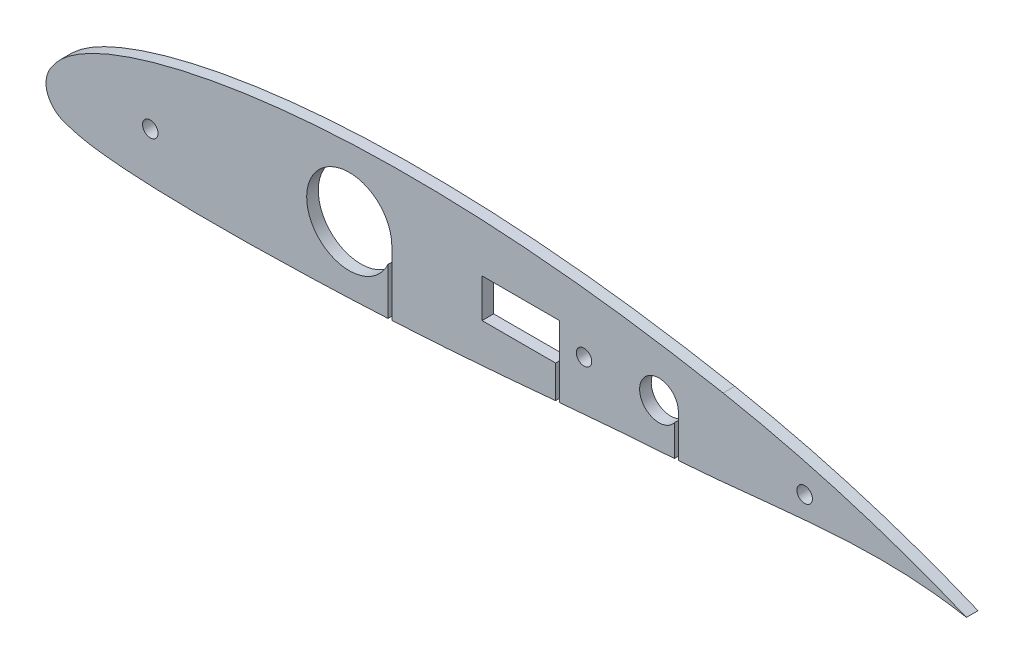
ISO-10303-21;
HEADER;
FILE_DESCRIPTION(('STEP AP214'),'2;1');
FILE_NAME('part.step','',(''),(''),'','','');
FILE_SCHEMA(('AUTOMOTIVE_DESIGN { 1 0 10303 214 1 1 1 1 }'));
ENDSEC;
DATA;
#1=APPLICATION_CONTEXT('core data for automotive mechanical design processes');
#2=APPLICATION_PROTOCOL_DEFINITION('international standard','automotive_design',2000,#1);
#3=PRODUCT_CONTEXT('',#1,'mechanical');
#4=PRODUCT('Part','Part','',(#3));
#5=PRODUCT_RELATED_PRODUCT_CATEGORY('part','',(#4));
#6=PRODUCT_DEFINITION_FORMATION('','',#4);
#7=PRODUCT_DEFINITION_CONTEXT('part definition',#1,'design');
#8=PRODUCT_DEFINITION('design','',#6,#7);
#9=PRODUCT_DEFINITION_SHAPE('','',#8);
#10=(LENGTH_UNIT() NAMED_UNIT(*) SI_UNIT(.MILLI.,.METRE.));
#11=(NAMED_UNIT(*) PLANE_ANGLE_UNIT() SI_UNIT($,.RADIAN.));
#12=(NAMED_UNIT(*) SI_UNIT($,.STERADIAN.) SOLID_ANGLE_UNIT());
#13=UNCERTAINTY_MEASURE_WITH_UNIT(LENGTH_MEASURE(1.E-05),#10,'distance_accuracy_value','');
#14=(GEOMETRIC_REPRESENTATION_CONTEXT(3) GLOBAL_UNCERTAINTY_ASSIGNED_CONTEXT((#13)) GLOBAL_UNIT_ASSIGNED_CONTEXT((#10,
#11,#12)) REPRESENTATION_CONTEXT('',''));
#15=CARTESIAN_POINT('',(0.,0.,0.));
#16=DIRECTION('',(0.,0.,1.));
#17=DIRECTION('',(1.,0.,0.));
#18=AXIS2_PLACEMENT_3D('',#15,#16,#17);
#19=CARTESIAN_POINT('',(23.2750330170003,31.2169723002843,3.));
#20=CARTESIAN_POINT('',(57.322884726353,25.0727517741864,3.));
#21=CARTESIAN_POINT('',(89.0015893645382,11.9045994903133,3.));
#22=B_SPLINE_CURVE_WITH_KNOTS('',2,(#19,#20,#21),.UNSPECIFIED.,.F.,.F.,(3,3),(0.,1.),.UNSPECIFIED.);
#23=DIRECTION('',(0.,0.,-1.));
#24=VECTOR('',#23,1.);
#25=SURFACE_OF_LINEAR_EXTRUSION('',#22,#24);
#26=CARTESIAN_POINT('',(23.2750330170003,31.2169723002843,0.));
#27=CARTESIAN_POINT('',(57.322884726353,25.0727517741864,0.));
#28=CARTESIAN_POINT('',(89.0015893645382,11.9045994903133,0.));
#29=B_SPLINE_CURVE_WITH_KNOTS('',2,(#26,#27,#28),.UNSPECIFIED.,.F.,.F.,(3,3),(0.,1.),.UNSPECIFIED.);
#30=CARTESIAN_POINT('',(26.1699744644814,30.6810485007294,0.));
#31=VERTEX_POINT('',#30);
#32=CARTESIAN_POINT('',(89.0015893645382,11.9045994903133,0.));
#33=VERTEX_POINT('',#32);
#34=EDGE_CURVE('E319',#31,#33,#29,.T.);
#35=ORIENTED_EDGE('',*,*,#34,.F.);
#36=DIRECTION('',(0.,0.,-1.));
#37=VECTOR('',#36,1.);
#38=CARTESIAN_POINT('',(26.1699744644814,30.6810485007294,3.));
#39=LINE('',#38,#37);
#40=CARTESIAN_POINT('',(26.1699744644814,30.6810485007294,3.));
#41=VERTEX_POINT('',#40);
#42=EDGE_CURVE('E11',#41,#31,#39,.T.);
#43=ORIENTED_EDGE('',*,*,#42,.F.);
#44=CARTESIAN_POINT('',(89.0015893645382,11.9045994903133,3.));
#45=VERTEX_POINT('',#44);
#46=EDGE_CURVE('E278',#41,#45,#22,.T.);
#47=ORIENTED_EDGE('',*,*,#46,.T.);
#48=DIRECTION('',(0.,0.,-1.));
#49=VECTOR('',#48,1.);
#50=CARTESIAN_POINT('',(89.0015893645382,11.9045994903133,3.));
#51=LINE('',#50,#49);
#52=EDGE_CURVE('E112',#45,#33,#51,.T.);
#53=ORIENTED_EDGE('',*,*,#52,.T.);
#54=EDGE_LOOP('',(#35,#43,#47,#53));
#55=FACE_BOUND('',#54,.T.);
#56=ADVANCED_FACE('F36',(#55),#25,.T.);
#57=CARTESIAN_POINT('',(26.1704792292799,30.6809526939739,3.));
#58=CARTESIAN_POINT('',(25.0717405489506,30.8872838946798,3.));
#59=CARTESIAN_POINT('',(21.652580786169,31.5190877367356,3.));
#60=CARTESIAN_POINT('',(15.9021602601808,32.5263185505152,3.));
#61=CARTESIAN_POINT('',(6.5790106509309,34.0330156957258,3.));
#62=CARTESIAN_POINT('',(-5.13305586683516,35.6661162166546,3.));
#63=CARTESIAN_POINT('',(-19.2486482424457,37.1612529151443,3.));
#64=CARTESIAN_POINT('',(-33.4033089772614,38.2059301904757,3.));
#65=CARTESIAN_POINT('',(-47.6088661564467,38.7588946065387,3.));
#66=CARTESIAN_POINT('',(-61.8320058552231,38.778890696768,3.));
#67=CARTESIAN_POINT('',(-73.7054715748674,38.3053812763915,3.));
#68=CARTESIAN_POINT('',(-83.1964144769099,37.5817759337847,3.));
#69=CARTESIAN_POINT('',(-90.3084209767789,36.856137814495,3.));
#70=CARTESIAN_POINT('',(-97.4054819679649,35.9335334631067,3.));
#71=CARTESIAN_POINT('',(-104.490167790152,34.7992842236308,3.));
#72=CARTESIAN_POINT('',(-111.557384973087,33.4138010473869,3.));
#73=CARTESIAN_POINT('',(-117.418017458013,32.0271748518416,3.));
#74=CARTESIAN_POINT('',(-122.096415740499,30.7376651009451,3.));
#75=CARTESIAN_POINT('',(-125.595780153855,29.6654094572892,3.));
#76=CARTESIAN_POINT('',(-129.078314362397,28.4750657683779,3.));
#77=CARTESIAN_POINT('',(-132.551428441074,27.1359892047304,3.));
#78=CARTESIAN_POINT('',(-135.438628174777,25.8622456958523,3.));
#79=CARTESIAN_POINT('',(-137.734204272677,24.7127565401623,3.));
#80=CARTESIAN_POINT('',(-139.456975034569,23.7687359755543,3.));
#81=CARTESIAN_POINT('',(-141.183426846913,22.7095626994774,3.));
#82=CARTESIAN_POINT('',(-142.615229883941,21.7137600315637,3.));
#83=CARTESIAN_POINT('',(-143.778010070149,20.7915841528106,3.));
#84=CARTESIAN_POINT('',(-144.642296680003,20.0313522172483,3.));
#85=CARTESIAN_POINT('',(-145.488501268653,19.1917681703995,3.));
#86=CARTESIAN_POINT('',(-146.295459405737,18.2764703412122,3.));
#87=CARTESIAN_POINT('',(-146.924853395195,17.4460153744084,3.));
#88=CARTESIAN_POINT('',(-147.402133682582,16.7479200861963,3.));
#89=CARTESIAN_POINT('',(-147.861509391881,15.9872821842199,3.));
#90=CARTESIAN_POINT('',(-148.257481401975,15.1336275035934,3.));
#91=CARTESIAN_POINT('',(-148.525334698643,14.278259778442,3.));
#92=CARTESIAN_POINT('',(-148.652359182012,13.6789166841946,3.));
#93=CARTESIAN_POINT('',(-148.715065866693,13.1462221173314,3.));
#94=CARTESIAN_POINT('',(-148.743623833541,12.7702519323825,3.));
#95=CARTESIAN_POINT('',(-148.736306405036,12.1170794840155,3.));
#96=CARTESIAN_POINT('',(-148.641099683932,11.3518403393092,3.));
#97=CARTESIAN_POINT('',(-148.411222248835,10.482363072398,3.));
#98=CARTESIAN_POINT('',(-147.899630282323,9.33270938205806,3.));
#99=CARTESIAN_POINT('',(-147.131184271557,8.25338851377815,3.));
#100=CARTESIAN_POINT('',(-146.090595980271,7.28025085323282,3.));
#101=CARTESIAN_POINT('',(-145.034194906505,6.60431910234987,3.));
#102=CARTESIAN_POINT('',(-144.099388819754,6.17635609162901,3.));
#103=CARTESIAN_POINT('',(-143.327943825418,5.90725228821735,3.));
#104=CARTESIAN_POINT('',(-142.744414150697,5.73697335113027,3.));
#105=CARTESIAN_POINT('',(-142.324681368872,5.61809019188374,3.));
#106=CARTESIAN_POINT('',(-141.712355660487,5.44663637945664,3.));
#107=CARTESIAN_POINT('',(-140.948050307236,5.24093024503892,3.));
#108=CARTESIAN_POINT('',(-139.679457393446,4.92319090354122,3.));
#109=CARTESIAN_POINT('',(-138.006428536994,4.57592919565911,3.));
#110=CARTESIAN_POINT('',(-136.07939986065,4.27856887698454,3.));
#111=CARTESIAN_POINT('',(-134.23248766641,4.04820020820924,3.));
#112=CARTESIAN_POINT('',(-132.422823201688,3.84902121924409,3.));
#113=CARTESIAN_POINT('',(-130.005739205579,3.61690026067817,3.));
#114=CARTESIAN_POINT('',(-126.996429967849,3.3866910853606,3.));
#115=CARTESIAN_POINT('',(-123.404146631862,3.18712871164537,3.));
#116=CARTESIAN_POINT('',(-119.838868339944,3.04101931502466,3.));
#117=CARTESIAN_POINT('',(-116.279828867201,2.93544987488144,3.));
#118=CARTESIAN_POINT('',(-111.547802169114,2.84039807880746,3.));
#119=CARTESIAN_POINT('',(-105.642152982149,2.793208736225,3.));
#120=CARTESIAN_POINT('',(-98.5711569175861,2.82663766533563,3.));
#121=CARTESIAN_POINT('',(-91.5113595976478,2.93151483705376,3.));
#122=CARTESIAN_POINT('',(-84.4586430065639,3.09693138211099,3.));
#123=CARTESIAN_POINT('',(-75.05737687348,3.39102216663977,3.));
#124=CARTESIAN_POINT('',(-67.0431312582729,3.73563635821174,3.));
#125=CARTESIAN_POINT('',(-61.3781790643248,4.02392346362659,3.));
#126=CARTESIAN_POINT('',(-60.4067661398195,4.07473548579845,3.));
#127=B_SPLINE_CURVE_WITH_KNOTS('',3,(#57,#58,#59,#60,#61,#62,#63,#64,#65,#66,#67,#68,#69,#70,
#71,#72,#73,#74,#75,#76,#77,#78,#79,#80,#81,#82,#83,#84,#85,#86,#87,#88,#89,#90,#91,#92,#93,#94,
#95,#96,#97,#98,#99,#100,#101,#102,#103,#104,#105,#106,#107,#108,#109,#110,#111,#112,#113,#114,
#115,#116,#117,#118,#119,#120,#121,#122,#123,#124,#125,#126),.UNSPECIFIED.,.F.,.F.,(4,1,1,1,1,1,
1,1,1,1,1,1,1,1,1,1,1,1,1,1,1,1,1,1,1,1,1,1,1,1,1,1,1,1,1,1,1,1,1,1,1,1,1,1,1,1,1,1,1,1,1,1,1,1,
1,1,1,1,1,1,1,1,1,1,1,1,1,4),(1.11759424258564,1.125,1.140625,1.15625,1.1875,1.21875,1.25,
1.28125,1.3125,1.34375,1.359375,1.375,1.390625,1.40625,1.421875,1.4375,1.4453125,1.453125,
1.4609375,1.46875,1.4765625,1.48046875,1.484375,1.48828125,1.4921875,1.494140625,1.49609375,
1.498046875,1.5,1.501953125,1.5029296875,1.50390625,1.5048828125,1.50537109375,1.505859375,
1.506103515625,1.50634765625,1.506591796875,1.5068359375,1.50732421875,1.5078125,1.5087890625,
1.509765625,1.5107421875,1.51171875,1.5126953125,1.513671875,1.5146484375,1.515625,1.517578125,
1.51953125,1.5234375,1.52734375,1.53125,1.53515625,1.5390625,1.546875,1.5546875,1.5625,
1.5703125,1.578125,1.59375,1.609375,1.625,1.640625,1.65625,1.6875,1.69396803900978),.UNSPECIFIED.);
#128=DIRECTION('',(0.,0.,-1.));
#129=VECTOR('',#128,1.);
#130=SURFACE_OF_LINEAR_EXTRUSION('',#127,#129);
#131=CARTESIAN_POINT('',(26.1704792292799,30.6809526939739,0.));
#132=CARTESIAN_POINT('',(25.0717405489506,30.8872838946798,0.));
#133=CARTESIAN_POINT('',(21.652580786169,31.5190877367356,0.));
#134=CARTESIAN_POINT('',(15.9021602601808,32.5263185505152,0.));
#135=CARTESIAN_POINT('',(6.5790106509309,34.0330156957258,0.));
#136=CARTESIAN_POINT('',(-5.13305586683516,35.6661162166546,0.));
#137=CARTESIAN_POINT('',(-19.2486482424457,37.1612529151443,0.));
#138=CARTESIAN_POINT('',(-33.4033089772614,38.2059301904757,0.));
#139=CARTESIAN_POINT('',(-47.6088661564467,38.7588946065387,0.));
#140=CARTESIAN_POINT('',(-61.8320058552231,38.778890696768,0.));
#141=CARTESIAN_POINT('',(-73.7054715748674,38.3053812763915,0.));
#142=CARTESIAN_POINT('',(-83.1964144769099,37.5817759337847,0.));
#143=CARTESIAN_POINT('',(-90.3084209767789,36.856137814495,0.));
#144=CARTESIAN_POINT('',(-97.4054819679649,35.9335334631067,0.));
#145=CARTESIAN_POINT('',(-104.490167790152,34.7992842236308,0.));
#146=CARTESIAN_POINT('',(-111.557384973087,33.4138010473869,0.));
#147=CARTESIAN_POINT('',(-117.418017458013,32.0271748518416,0.));
#148=CARTESIAN_POINT('',(-122.096415740499,30.7376651009451,0.));
#149=CARTESIAN_POINT('',(-125.595780153855,29.6654094572892,0.));
#150=CARTESIAN_POINT('',(-129.078314362397,28.4750657683779,0.));
#151=CARTESIAN_POINT('',(-132.551428441074,27.1359892047304,0.));
#152=CARTESIAN_POINT('',(-135.438628174777,25.8622456958523,0.));
#153=CARTESIAN_POINT('',(-137.734204272677,24.7127565401623,0.));
#154=CARTESIAN_POINT('',(-139.456975034569,23.7687359755543,0.));
#155=CARTESIAN_POINT('',(-141.183426846913,22.7095626994774,0.));
#156=CARTESIAN_POINT('',(-142.615229883941,21.7137600315637,0.));
#157=CARTESIAN_POINT('',(-143.778010070149,20.7915841528106,0.));
#158=CARTESIAN_POINT('',(-144.642296680003,20.0313522172483,0.));
#159=CARTESIAN_POINT('',(-145.488501268653,19.1917681703995,0.));
#160=CARTESIAN_POINT('',(-146.295459405737,18.2764703412122,0.));
#161=CARTESIAN_POINT('',(-146.924853395195,17.4460153744084,0.));
#162=CARTESIAN_POINT('',(-147.402133682582,16.7479200861963,0.));
#163=CARTESIAN_POINT('',(-147.861509391881,15.9872821842199,0.));
#164=CARTESIAN_POINT('',(-148.257481401975,15.1336275035934,0.));
#165=CARTESIAN_POINT('',(-148.525334698643,14.278259778442,0.));
#166=CARTESIAN_POINT('',(-148.652359182012,13.6789166841946,0.));
#167=CARTESIAN_POINT('',(-148.715065866693,13.1462221173314,0.));
#168=CARTESIAN_POINT('',(-148.743623833541,12.7702519323825,0.));
#169=CARTESIAN_POINT('',(-148.736306405036,12.1170794840155,0.));
#170=CARTESIAN_POINT('',(-148.641099683932,11.3518403393092,0.));
#171=CARTESIAN_POINT('',(-148.411222248835,10.482363072398,0.));
#172=CARTESIAN_POINT('',(-147.899630282323,9.33270938205806,0.));
#173=CARTESIAN_POINT('',(-147.131184271557,8.25338851377815,0.));
#174=CARTESIAN_POINT('',(-146.090595980271,7.28025085323282,0.));
#175=CARTESIAN_POINT('',(-145.034194906505,6.60431910234987,0.));
#176=CARTESIAN_POINT('',(-144.099388819754,6.17635609162901,0.));
#177=CARTESIAN_POINT('',(-143.327943825418,5.90725228821735,0.));
#178=CARTESIAN_POINT('',(-142.744414150697,5.73697335113027,0.));
#179=CARTESIAN_POINT('',(-142.324681368872,5.61809019188374,0.));
#180=CARTESIAN_POINT('',(-141.712355660487,5.44663637945664,0.));
#181=CARTESIAN_POINT('',(-140.948050307236,5.24093024503892,0.));
#182=CARTESIAN_POINT('',(-139.679457393446,4.92319090354122,0.));
#183=CARTESIAN_POINT('',(-138.006428536994,4.57592919565911,0.));
#184=CARTESIAN_POINT('',(-136.07939986065,4.27856887698454,0.));
#185=CARTESIAN_POINT('',(-134.23248766641,4.04820020820924,0.));
#186=CARTESIAN_POINT('',(-132.422823201688,3.84902121924409,0.));
#187=CARTESIAN_POINT('',(-130.005739205579,3.61690026067817,0.));
#188=CARTESIAN_POINT('',(-126.996429967849,3.3866910853606,0.));
#189=CARTESIAN_POINT('',(-123.404146631862,3.18712871164537,0.));
#190=CARTESIAN_POINT('',(-119.838868339944,3.04101931502466,0.));
#191=CARTESIAN_POINT('',(-116.279828867201,2.93544987488144,0.));
#192=CARTESIAN_POINT('',(-111.547802169114,2.84039807880746,0.));
#193=CARTESIAN_POINT('',(-105.642152982149,2.793208736225,0.));
#194=CARTESIAN_POINT('',(-98.5711569175861,2.82663766533563,0.));
#195=CARTESIAN_POINT('',(-91.5113595976478,2.93151483705376,0.));
#196=CARTESIAN_POINT('',(-84.4586430065639,3.09693138211099,0.));
#197=CARTESIAN_POINT('',(-75.05737687348,3.39102216663977,0.));
#198=CARTESIAN_POINT('',(-67.0431312582729,3.73563635821174,0.));
#199=CARTESIAN_POINT('',(-61.3781790643248,4.02392346362659,0.));
#200=CARTESIAN_POINT('',(-60.4067661398195,4.07473548579845,0.));
#201=B_SPLINE_CURVE_WITH_KNOTS('',3,(#131,#132,#133,#134,#135,#136,#137,#138,#139,#140,#141,
#142,#143,#144,#145,#146,#147,#148,#149,#150,#151,#152,#153,#154,#155,#156,#157,#158,#159,#160,
#161,#162,#163,#164,#165,#166,#167,#168,#169,#170,#171,#172,#173,#174,#175,#176,#177,#178,#179,
#180,#181,#182,#183,#184,#185,#186,#187,#188,#189,#190,#191,#192,#193,#194,#195,#196,#197,#198,
#199,#200),.UNSPECIFIED.,.F.,.F.,(4,1,1,1,1,1,1,1,1,1,1,1,1,1,1,1,1,1,1,1,1,1,1,1,1,1,1,1,1,1,1,
1,1,1,1,1,1,1,1,1,1,1,1,1,1,1,1,1,1,1,1,1,1,1,1,1,1,1,1,1,1,1,1,1,1,1,1,4),(1.11759424258564,
1.125,1.140625,1.15625,1.1875,1.21875,1.25,1.28125,1.3125,1.34375,1.359375,1.375,1.390625,
1.40625,1.421875,1.4375,1.4453125,1.453125,1.4609375,1.46875,1.4765625,1.48046875,1.484375,
1.48828125,1.4921875,1.494140625,1.49609375,1.498046875,1.5,1.501953125,1.5029296875,1.50390625,
1.5048828125,1.50537109375,1.505859375,1.506103515625,1.50634765625,1.506591796875,1.5068359375,
1.50732421875,1.5078125,1.5087890625,1.509765625,1.5107421875,1.51171875,1.5126953125,
1.513671875,1.5146484375,1.515625,1.517578125,1.51953125,1.5234375,1.52734375,1.53125,
1.53515625,1.5390625,1.546875,1.5546875,1.5625,1.5703125,1.578125,1.59375,1.609375,1.625,
1.640625,1.65625,1.6875,1.69396803900978),.UNSPECIFIED.);
#202=CARTESIAN_POINT('',(-60.4067661398195,4.07473548579845,0.));
#203=VERTEX_POINT('',#202);
#204=EDGE_CURVE('E318',#31,#203,#201,.T.);
#205=ORIENTED_EDGE('',*,*,#204,.T.);
#206=DIRECTION('',(0.,0.,-1.));
#207=VECTOR('',#206,1.);
#208=CARTESIAN_POINT('',(-60.4067661398195,4.07473548579845,3.));
#209=LINE('',#208,#207);
#210=CARTESIAN_POINT('',(-60.4067661398195,4.07473548579845,3.));
#211=VERTEX_POINT('',#210);
#212=EDGE_CURVE('E45',#211,#203,#209,.T.);
#213=ORIENTED_EDGE('',*,*,#212,.F.);
#214=EDGE_CURVE('E272',#41,#211,#127,.T.);
#215=ORIENTED_EDGE('',*,*,#214,.F.);
#216=ORIENTED_EDGE('',*,*,#42,.T.);
#217=EDGE_LOOP('',(#205,#213,#215,#216));
#218=FACE_BOUND('',#217,.T.);
#219=ADVANCED_FACE('F264',(#218),#130,.F.);
#220=CARTESIAN_POINT('',(-60.4067661398195,0.,3.));
#221=DIRECTION('',(1.,0.,0.));
#222=DIRECTION('',(0.,1.,0.));
#223=AXIS2_PLACEMENT_3D('',#220,#221,#222);
#224=PLANE('',#223);
#225=DIRECTION('',(0.,-1.,0.));
#226=VECTOR('',#225,1.);
#227=CARTESIAN_POINT('',(-60.4067661398195,0.,0.));
#228=LINE('',#227,#226);
#229=CARTESIAN_POINT('',(-60.4067661398195,16.162496641787,0.));
#230=VERTEX_POINT('',#229);
#231=EDGE_CURVE('E315',#230,#203,#228,.T.);
#232=ORIENTED_EDGE('',*,*,#231,.F.);
#233=DIRECTION('',(0.,0.,-1.));
#234=VECTOR('',#233,1.);
#235=CARTESIAN_POINT('',(-60.4067661398195,16.162496641787,3.));
#236=LINE('',#235,#234);
#237=CARTESIAN_POINT('',(-60.4067661398195,16.162496641787,3.));
#238=VERTEX_POINT('',#237);
#239=EDGE_CURVE('E305',#238,#230,#236,.T.);
#240=ORIENTED_EDGE('',*,*,#239,.F.);
#241=DIRECTION('',(0.,-1.,0.));
#242=VECTOR('',#241,1.);
#243=CARTESIAN_POINT('',(-60.4067661398195,0.,3.));
#244=LINE('',#243,#242);
#245=EDGE_CURVE('E277',#238,#211,#244,.T.);
#246=ORIENTED_EDGE('',*,*,#245,.T.);
#247=ORIENTED_EDGE('',*,*,#212,.T.);
#248=EDGE_LOOP('',(#232,#240,#246,#247));
#249=FACE_BOUND('',#248,.T.);
#250=ADVANCED_FACE('F260',(#249),#224,.T.);
#251=CARTESIAN_POINT('',(-70.4067661398195,20.7450723367429,3.));
#252=DIRECTION('',(0.,0.,-1.));
#253=DIRECTION('',(-1.,0.,0.));
#254=AXIS2_PLACEMENT_3D('',#251,#252,#253);
#255=CYLINDRICAL_SURFACE('',#254,11.);
#256=CARTESIAN_POINT('',(-70.4067661398195,20.7450723367429,0.));
#257=DIRECTION('',(0.,0.,1.));
#258=DIRECTION('',(1.,0.,0.));
#259=AXIS2_PLACEMENT_3D('',#256,#257,#258);
#260=CIRCLE('',#259,11.);
#261=CARTESIAN_POINT('',(-59.4067661398195,20.7450723367429,0.));
#262=VERTEX_POINT('',#261);
#263=EDGE_CURVE('E322',#262,#230,#260,.T.);
#264=ORIENTED_EDGE('',*,*,#263,.F.);
#265=DIRECTION('',(0.,0.,-1.));
#266=VECTOR('',#265,1.);
#267=CARTESIAN_POINT('',(-59.4067661398195,20.7450723367429,3.));
#268=LINE('',#267,#266);
#269=CARTESIAN_POINT('',(-59.4067661398195,20.7450723367429,3.));
#270=VERTEX_POINT('',#269);
#271=EDGE_CURVE('E302',#270,#262,#268,.T.);
#272=ORIENTED_EDGE('',*,*,#271,.F.);
#273=CARTESIAN_POINT('',(-70.4067661398195,20.7450723367429,3.));
#274=DIRECTION('',(0.,0.,1.));
#275=DIRECTION('',(1.,0.,0.));
#276=AXIS2_PLACEMENT_3D('',#273,#274,#275);
#277=CIRCLE('',#276,11.);
#278=EDGE_CURVE('E287',#270,#238,#277,.T.);
#279=ORIENTED_EDGE('',*,*,#278,.T.);
#280=ORIENTED_EDGE('',*,*,#239,.T.);
#281=EDGE_LOOP('',(#264,#272,#279,#280));
#282=FACE_BOUND('',#281,.T.);
#283=ADVANCED_FACE('F256',(#282),#255,.F.);
#284=CARTESIAN_POINT('',(-59.4067661397845,-1.00216857145309E-10,3.));
#285=DIRECTION('',(1.,1.68696031878757E-12,0.));
#286=DIRECTION('',(-1.68696031878757E-12,1.,0.));
#287=AXIS2_PLACEMENT_3D('',#284,#285,#286);
#288=PLANE('',#287);
#289=DIRECTION('',(1.68696031878757E-12,-1.,0.));
#290=VECTOR('',#289,1.);
#291=CARTESIAN_POINT('',(-59.4067661397845,-1.00216857145309E-10,0.));
#292=LINE('',#291,#290);
#293=CARTESIAN_POINT('',(-59.4067661397915,4.12753186493565,0.));
#294=VERTEX_POINT('',#293);
#295=EDGE_CURVE('E300',#262,#294,#292,.T.);
#296=ORIENTED_EDGE('',*,*,#295,.T.);
#297=DIRECTION('',(0.,0.,-1.));
#298=VECTOR('',#297,1.);
#299=CARTESIAN_POINT('',(-59.4067661397915,4.12753186493565,3.));
#300=LINE('',#299,#298);
#301=CARTESIAN_POINT('',(-59.4067661397915,4.12753186493565,3.));
#302=VERTEX_POINT('',#301);
#303=EDGE_CURVE('E298',#302,#294,#300,.T.);
#304=ORIENTED_EDGE('',*,*,#303,.F.);
#305=DIRECTION('',(1.68696031878757E-12,-1.,0.));
#306=VECTOR('',#305,1.);
#307=CARTESIAN_POINT('',(-59.4067661397845,-1.00216857145309E-10,3.));
#308=LINE('',#307,#306);
#309=EDGE_CURVE('E240',#270,#302,#308,.T.);
#310=ORIENTED_EDGE('',*,*,#309,.F.);
#311=ORIENTED_EDGE('',*,*,#271,.T.);
#312=EDGE_LOOP('',(#296,#304,#310,#311));
#313=FACE_BOUND('',#312,.T.);
#314=ADVANCED_FACE('F251',(#313),#288,.F.);
#315=CARTESIAN_POINT('',(-59.4067661397915,4.12753186493565,3.));
#316=CARTESIAN_POINT('',(-56.0182624660336,4.30809830812969,3.));
#317=CARTESIAN_POINT('',(-47.9373947517638,4.77930521150218,3.));
#318=CARTESIAN_POINT('',(-35.1604455354936,5.70122012154874,3.));
#319=CARTESIAN_POINT('',(-24.5368897770547,6.64880940723432,3.));
#320=CARTESIAN_POINT('',(-18.536419356835,7.18806200044425,3.));
#321=CARTESIAN_POINT('',(-17.1925021910671,7.30833533823907,3.));
#322=CARTESIAN_POINT('',(-17.1091615579232,7.31579112948369,3.));
#323=B_SPLINE_CURVE_WITH_KNOTS('',3,(#315,#316,#317,#318,#319,#320,#321,#322),.UNSPECIFIED.,.F.,
.F.,(4,1,1,1,1,4),(1.69618752623767,1.71875,1.75,1.78125,1.78971973670714,1.79027971787844),.UNSPECIFIED.);
#324=DIRECTION('',(0.,0.,-1.));
#325=VECTOR('',#324,1.);
#326=SURFACE_OF_LINEAR_EXTRUSION('',#323,#325);
#327=CARTESIAN_POINT('',(-59.4067661397915,4.12753186493565,0.));
#328=CARTESIAN_POINT('',(-56.0182624660336,4.30809830812969,0.));
#329=CARTESIAN_POINT('',(-47.9373947517638,4.77930521150218,0.));
#330=CARTESIAN_POINT('',(-35.1604455354936,5.70122012154874,0.));
#331=CARTESIAN_POINT('',(-24.5368897770547,6.64880940723432,0.));
#332=CARTESIAN_POINT('',(-18.536419356835,7.18806200044425,0.));
#333=CARTESIAN_POINT('',(-17.1925021910671,7.30833533823907,0.));
#334=CARTESIAN_POINT('',(-17.1091615579232,7.31579112948369,0.));
#335=B_SPLINE_CURVE_WITH_KNOTS('',3,(#327,#328,#329,#330,#331,#332,#333,#334),.UNSPECIFIED.,.F.,
.F.,(4,1,1,1,1,4),(1.69618752623767,1.71875,1.75,1.78125,1.78971973670714,1.79027971787844),.UNSPECIFIED.);
#336=CARTESIAN_POINT('',(-17.1091615579232,7.31579112948369,0.));
#337=VERTEX_POINT('',#336);
#338=EDGE_CURVE('E330',#294,#337,#335,.T.);
#339=ORIENTED_EDGE('',*,*,#338,.T.);
#340=DIRECTION('',(0.,0.,-1.));
#341=VECTOR('',#340,1.);
#342=CARTESIAN_POINT('',(-17.1091615579232,7.31579112948369,3.));
#343=LINE('',#342,#341);
#344=CARTESIAN_POINT('',(-17.1091615579232,7.31579112948369,3.));
#345=VERTEX_POINT('',#344);
#346=EDGE_CURVE('E303',#345,#337,#343,.T.);
#347=ORIENTED_EDGE('',*,*,#346,.F.);
#348=EDGE_CURVE('E235',#302,#345,#323,.T.);
#349=ORIENTED_EDGE('',*,*,#348,.F.);
#350=ORIENTED_EDGE('',*,*,#303,.T.);
#351=EDGE_LOOP('',(#339,#347,#349,#350));
#352=FACE_BOUND('',#351,.T.);
#353=ADVANCED_FACE('F246',(#352),#326,.F.);
#354=CARTESIAN_POINT('',(-17.1091615579232,0.,3.));
#355=DIRECTION('',(1.,0.,0.));
#356=DIRECTION('',(0.,1.,0.));
#357=AXIS2_PLACEMENT_3D('',#354,#355,#356);
#358=PLANE('',#357);
#359=DIRECTION('',(0.,-1.,0.));
#360=VECTOR('',#359,1.);
#361=CARTESIAN_POINT('',(-17.1091615579232,0.,0.));
#362=LINE('',#361,#360);
#363=CARTESIAN_POINT('',(-17.1091615579232,15.7450723367429,0.));
#364=VERTEX_POINT('',#363);
#365=EDGE_CURVE('E334',#364,#337,#362,.T.);
#366=ORIENTED_EDGE('',*,*,#365,.F.);
#367=DIRECTION('',(0.,0.,-1.));
#368=VECTOR('',#367,1.);
#369=CARTESIAN_POINT('',(-17.1091615579232,15.7450723367429,3.));
#370=LINE('',#369,#368);
#371=CARTESIAN_POINT('',(-17.1091615579232,15.7450723367429,3.));
#372=VERTEX_POINT('',#371);
#373=EDGE_CURVE('E307',#372,#364,#370,.T.);
#374=ORIENTED_EDGE('',*,*,#373,.F.);
#375=DIRECTION('',(0.,-1.,0.));
#376=VECTOR('',#375,1.);
#377=CARTESIAN_POINT('',(-17.1091615579232,0.,3.));
#378=LINE('',#377,#376);
#379=EDGE_CURVE('E232',#372,#345,#378,.T.);
#380=ORIENTED_EDGE('',*,*,#379,.T.);
#381=ORIENTED_EDGE('',*,*,#346,.T.);
#382=EDGE_LOOP('',(#366,#374,#380,#381));
#383=FACE_BOUND('',#382,.T.);
#384=ADVANCED_FACE('F250',(#383),#358,.T.);
#385=CARTESIAN_POINT('',(0.,15.7450723367429,3.));
#386=DIRECTION('',(0.,1.,0.));
#387=DIRECTION('',(0.,0.,1.));
#388=AXIS2_PLACEMENT_3D('',#385,#386,#387);
#389=PLANE('',#388);
#390=DIRECTION('',(1.,0.,0.));
#391=VECTOR('',#390,1.);
#392=CARTESIAN_POINT('',(0.,15.7450723367429,0.));
#393=LINE('',#392,#391);
#394=CARTESIAN_POINT('',(-36.1091615579232,15.7450723367429,0.));
#395=VERTEX_POINT('',#394);
#396=EDGE_CURVE('E340',#395,#364,#393,.T.);
#397=ORIENTED_EDGE('',*,*,#396,.F.);
#398=DIRECTION('',(0.,0.,-1.));
#399=VECTOR('',#398,1.);
#400=CARTESIAN_POINT('',(-36.1091615579232,15.7450723367429,3.));
#401=LINE('',#400,#399);
#402=CARTESIAN_POINT('',(-36.1091615579232,15.7450723367429,3.));
#403=VERTEX_POINT('',#402);
#404=EDGE_CURVE('E386',#403,#395,#401,.T.);
#405=ORIENTED_EDGE('',*,*,#404,.F.);
#406=DIRECTION('',(1.,0.,0.));
#407=VECTOR('',#406,1.);
#408=CARTESIAN_POINT('',(0.,15.7450723367429,3.));
#409=LINE('',#408,#407);
#410=EDGE_CURVE('E229',#403,#372,#409,.T.);
#411=ORIENTED_EDGE('',*,*,#410,.T.);
#412=ORIENTED_EDGE('',*,*,#373,.T.);
#413=EDGE_LOOP('',(#397,#405,#411,#412));
#414=FACE_BOUND('',#413,.T.);
#415=ADVANCED_FACE('F390',(#414),#389,.T.);
#416=CARTESIAN_POINT('',(-36.1091615579232,0.,3.));
#417=DIRECTION('',(1.,0.,0.));
#418=DIRECTION('',(0.,0.,-1.));
#419=AXIS2_PLACEMENT_3D('',#416,#417,#418);
#420=PLANE('',#419);
#421=DIRECTION('',(0.,-1.,0.));
#422=VECTOR('',#421,1.);
#423=CARTESIAN_POINT('',(-36.1091615579232,0.,0.));
#424=LINE('',#423,#422);
#425=CARTESIAN_POINT('',(-36.1091615579232,25.7450723367429,0.));
#426=VERTEX_POINT('',#425);
#427=EDGE_CURVE('E343',#426,#395,#424,.T.);
#428=ORIENTED_EDGE('',*,*,#427,.F.);
#429=DIRECTION('',(0.,0.,-1.));
#430=VECTOR('',#429,1.);
#431=CARTESIAN_POINT('',(-36.1091615579232,25.7450723367429,3.));
#432=LINE('',#431,#430);
#433=CARTESIAN_POINT('',(-36.1091615579232,25.7450723367429,3.));
#434=VERTEX_POINT('',#433);
#435=EDGE_CURVE('E384',#434,#426,#432,.T.);
#436=ORIENTED_EDGE('',*,*,#435,.F.);
#437=DIRECTION('',(0.,-1.,0.));
#438=VECTOR('',#437,1.);
#439=CARTESIAN_POINT('',(-36.1091615579232,0.,3.));
#440=LINE('',#439,#438);
#441=EDGE_CURVE('E226',#434,#403,#440,.T.);
#442=ORIENTED_EDGE('',*,*,#441,.T.);
#443=ORIENTED_EDGE('',*,*,#404,.T.);
#444=EDGE_LOOP('',(#428,#436,#442,#443));
#445=FACE_BOUND('',#444,.T.);
#446=ADVANCED_FACE('F396',(#445),#420,.T.);
#447=CARTESIAN_POINT('',(0.,25.7450723367429,3.));
#448=DIRECTION('',(0.,1.,0.));
#449=DIRECTION('',(-1.,0.,0.));
#450=AXIS2_PLACEMENT_3D('',#447,#448,#449);
#451=PLANE('',#450);
#452=DIRECTION('',(1.,0.,0.));
#453=VECTOR('',#452,1.);
#454=CARTESIAN_POINT('',(0.,25.7450723367429,0.));
#455=LINE('',#454,#453);
#456=CARTESIAN_POINT('',(-16.1091615579232,25.7450723367429,0.));
#457=VERTEX_POINT('',#456);
#458=EDGE_CURVE('E346',#426,#457,#455,.T.);
#459=ORIENTED_EDGE('',*,*,#458,.T.);
#460=DIRECTION('',(0.,0.,-1.));
#461=VECTOR('',#460,1.);
#462=CARTESIAN_POINT('',(-16.1091615579232,25.7450723367429,3.));
#463=LINE('',#462,#461);
#464=CARTESIAN_POINT('',(-16.1091615579232,25.7450723367429,3.));
#465=VERTEX_POINT('',#464);
#466=EDGE_CURVE('E381',#465,#457,#463,.T.);
#467=ORIENTED_EDGE('',*,*,#466,.F.);
#468=DIRECTION('',(1.,0.,0.));
#469=VECTOR('',#468,1.);
#470=CARTESIAN_POINT('',(0.,25.7450723367429,3.));
#471=LINE('',#470,#469);
#472=EDGE_CURVE('E223',#434,#465,#471,.T.);
#473=ORIENTED_EDGE('',*,*,#472,.F.);
#474=ORIENTED_EDGE('',*,*,#435,.T.);
#475=EDGE_LOOP('',(#459,#467,#473,#474));
#476=FACE_BOUND('',#475,.T.);
#477=ADVANCED_FACE('F402',(#476),#451,.F.);
#478=CARTESIAN_POINT('',(-16.1091615579232,0.,3.));
#479=DIRECTION('',(1.,0.,0.));
#480=DIRECTION('',(0.,0.,-1.));
#481=AXIS2_PLACEMENT_3D('',#478,#479,#480);
#482=PLANE('',#481);
#483=DIRECTION('',(0.,-1.,0.));
#484=VECTOR('',#483,1.);
#485=CARTESIAN_POINT('',(-16.1091615579232,0.,0.));
#486=LINE('',#485,#484);
#487=CARTESIAN_POINT('',(-16.1091615579232,7.40509568474759,0.));
#488=VERTEX_POINT('',#487);
#489=EDGE_CURVE('E349',#457,#488,#486,.T.);
#490=ORIENTED_EDGE('',*,*,#489,.T.);
#491=DIRECTION('',(0.,0.,-1.));
#492=VECTOR('',#491,1.);
#493=CARTESIAN_POINT('',(-16.1091615579232,7.40509568474759,3.));
#494=LINE('',#493,#492);
#495=CARTESIAN_POINT('',(-16.1091615579232,7.40509568474759,3.));
#496=VERTEX_POINT('',#495);
#497=EDGE_CURVE('E378',#496,#488,#494,.T.);
#498=ORIENTED_EDGE('',*,*,#497,.F.);
#499=DIRECTION('',(0.,-1.,0.));
#500=VECTOR('',#499,1.);
#501=CARTESIAN_POINT('',(-16.1091615579232,0.,3.));
#502=LINE('',#501,#500);
#503=EDGE_CURVE('E217',#465,#496,#502,.T.);
#504=ORIENTED_EDGE('',*,*,#503,.F.);
#505=ORIENTED_EDGE('',*,*,#466,.T.);
#506=EDGE_LOOP('',(#490,#498,#504,#505));
#507=FACE_BOUND('',#506,.T.);
#508=ADVANCED_FACE('F210',(#507),#482,.F.);
#509=CARTESIAN_POINT('',(-16.1091615579232,7.40509568474759,3.));
#510=CARTESIAN_POINT('',(-16.0258354767455,7.41252342211866,3.));
#511=CARTESIAN_POINT('',(-13.052799235722,7.67741977805403,3.));
#512=CARTESIAN_POINT('',(-5.43779734463081,8.34525949702611,3.));
#513=CARTESIAN_POINT('',(3.85457574966918,9.08272896584929,3.));
#514=CARTESIAN_POINT('',(10.7793501712534,9.5498693564759,3.));
#515=CARTESIAN_POINT('',(13.0690202193863,9.69268039456268,3.));
#516=CARTESIAN_POINT('',(13.5932338601797,9.72473993954547,3.));
#517=B_SPLINE_CURVE_WITH_KNOTS('',3,(#509,#510,#511,#512,#513,#514,#515,#516),.UNSPECIFIED.,.F.,
.F.,(4,1,1,1,1,4),(0.792519642564869,0.793079623736703,0.8125,0.84375,0.8556589831669,
0.859195483568322),.UNSPECIFIED.);
#518=DIRECTION('',(0.,0.,-1.));
#519=VECTOR('',#518,1.);
#520=SURFACE_OF_LINEAR_EXTRUSION('',#517,#519);
#521=CARTESIAN_POINT('',(-16.1091615579232,7.40509568474759,0.));
#522=CARTESIAN_POINT('',(-16.0258354767455,7.41252342211866,0.));
#523=CARTESIAN_POINT('',(-13.052799235722,7.67741977805403,0.));
#524=CARTESIAN_POINT('',(-5.43779734463081,8.34525949702611,0.));
#525=CARTESIAN_POINT('',(3.85457574966918,9.08272896584929,0.));
#526=CARTESIAN_POINT('',(10.7793501712534,9.5498693564759,0.));
#527=CARTESIAN_POINT('',(13.0690202193863,9.69268039456268,0.));
#528=CARTESIAN_POINT('',(13.5932338601797,9.72473993954547,0.));
#529=B_SPLINE_CURVE_WITH_KNOTS('',3,(#521,#522,#523,#524,#525,#526,#527,#528),.UNSPECIFIED.,.F.,
.F.,(4,1,1,1,1,4),(0.792519642564869,0.793079623736703,0.8125,0.84375,0.8556589831669,
0.859195483568322),.UNSPECIFIED.);
#530=CARTESIAN_POINT('',(13.5932338601805,9.72473993954552,0.));
#531=VERTEX_POINT('',#530);
#532=EDGE_CURVE('E352',#488,#531,#529,.T.);
#533=ORIENTED_EDGE('',*,*,#532,.T.);
#534=DIRECTION('',(0.,0.,-1.));
#535=VECTOR('',#534,1.);
#536=CARTESIAN_POINT('',(13.5932338601805,9.72473993954552,3.));
#537=LINE('',#536,#535);
#538=CARTESIAN_POINT('',(13.5932338601805,9.72473993954552,3.));
#539=VERTEX_POINT('',#538);
#540=EDGE_CURVE('E376',#539,#531,#537,.T.);
#541=ORIENTED_EDGE('',*,*,#540,.F.);
#542=EDGE_CURVE('E177',#496,#539,#517,.T.);
#543=ORIENTED_EDGE('',*,*,#542,.F.);
#544=ORIENTED_EDGE('',*,*,#497,.T.);
#545=EDGE_LOOP('',(#533,#541,#543,#544));
#546=FACE_BOUND('',#545,.T.);
#547=ADVANCED_FACE('F206',(#546),#520,.F.);
#548=CARTESIAN_POINT('',(13.5932338601804,0.,3.));
#549=DIRECTION('',(1.,0.,0.));
#550=DIRECTION('',(0.,1.,0.));
#551=AXIS2_PLACEMENT_3D('',#548,#549,#550);
#552=PLANE('',#551);
#553=DIRECTION('',(0.,-1.,0.));
#554=VECTOR('',#553,1.);
#555=CARTESIAN_POINT('',(13.5932338601804,0.,0.));
#556=LINE('',#555,#554);
#557=CARTESIAN_POINT('',(13.5932338601805,17.7450723367429,0.));
#558=VERTEX_POINT('',#557);
#559=EDGE_CURVE('E357',#558,#531,#556,.T.);
#560=ORIENTED_EDGE('',*,*,#559,.F.);
#561=DIRECTION('',(0.,0.,-1.));
#562=VECTOR('',#561,1.);
#563=CARTESIAN_POINT('',(13.5932338601805,17.7450723367429,3.));
#564=LINE('',#563,#562);
#565=CARTESIAN_POINT('',(13.5932338601805,17.7450723367429,3.));
#566=VERTEX_POINT('',#565);
#567=EDGE_CURVE('E165',#566,#558,#564,.T.);
#568=ORIENTED_EDGE('',*,*,#567,.F.);
#569=DIRECTION('',(0.,-1.,0.));
#570=VECTOR('',#569,1.);
#571=CARTESIAN_POINT('',(13.5932338601804,0.,3.));
#572=LINE('',#571,#570);
#573=EDGE_CURVE('E175',#566,#539,#572,.T.);
#574=ORIENTED_EDGE('',*,*,#573,.T.);
#575=ORIENTED_EDGE('',*,*,#540,.T.);
#576=EDGE_LOOP('',(#560,#568,#574,#575));
#577=FACE_BOUND('',#576,.T.);
#578=ADVANCED_FACE('F203',(#577),#552,.T.);
#579=CARTESIAN_POINT('',(9.59323386018049,20.7450723367429,3.));
#580=DIRECTION('',(0.,0.,-1.));
#581=DIRECTION('',(-1.,0.,0.));
#582=AXIS2_PLACEMENT_3D('',#579,#580,#581);
#583=CYLINDRICAL_SURFACE('',#582,5.);
#584=CARTESIAN_POINT('',(9.59323386018049,20.7450723367429,0.));
#585=DIRECTION('',(0.,0.,1.));
#586=DIRECTION('',(1.,0.,0.));
#587=AXIS2_PLACEMENT_3D('',#584,#585,#586);
#588=CIRCLE('',#587,5.);
#589=CARTESIAN_POINT('',(14.5932338601805,20.7450723367429,0.));
#590=VERTEX_POINT('',#589);
#591=EDGE_CURVE('E162',#590,#558,#588,.T.);
#592=ORIENTED_EDGE('',*,*,#591,.F.);
#593=DIRECTION('',(0.,0.,-1.));
#594=VECTOR('',#593,1.);
#595=CARTESIAN_POINT('',(14.5932338601805,20.7450723367429,3.));
#596=LINE('',#595,#594);
#597=CARTESIAN_POINT('',(14.5932338601805,20.7450723367429,3.));
#598=VERTEX_POINT('',#597);
#599=EDGE_CURVE('E156',#598,#590,#596,.T.);
#600=ORIENTED_EDGE('',*,*,#599,.F.);
#601=CARTESIAN_POINT('',(9.59323386018049,20.7450723367429,3.));
#602=DIRECTION('',(0.,0.,1.));
#603=DIRECTION('',(1.,0.,0.));
#604=AXIS2_PLACEMENT_3D('',#601,#602,#603);
#605=CIRCLE('',#604,5.);
#606=EDGE_CURVE('E160',#598,#566,#605,.T.);
#607=ORIENTED_EDGE('',*,*,#606,.T.);
#608=ORIENTED_EDGE('',*,*,#567,.T.);
#609=EDGE_LOOP('',(#592,#600,#607,#608));
#610=FACE_BOUND('',#609,.T.);
#611=ADVANCED_FACE('F158',(#610),#583,.F.);
#612=CARTESIAN_POINT('',(14.5932338604705,2.04028868935734E-10,3.));
#613=DIRECTION('',(1.,1.39810593653541E-11,0.));
#614=DIRECTION('',(-1.39810593653541E-11,1.,0.));
#615=AXIS2_PLACEMENT_3D('',#612,#613,#614);
#616=PLANE('',#615);
#617=DIRECTION('',(1.39810593653541E-11,-1.,0.));
#618=VECTOR('',#617,1.);
#619=CARTESIAN_POINT('',(14.5932338604705,2.04028868935734E-10,0.));
#620=LINE('',#619,#618);
#621=CARTESIAN_POINT('',(14.5932338603337,9.78786042881447,0.));
#622=VERTEX_POINT('',#621);
#623=EDGE_CURVE('E364',#590,#622,#620,.T.);
#624=ORIENTED_EDGE('',*,*,#623,.T.);
#625=DIRECTION('',(0.,0.,-1.));
#626=VECTOR('',#625,1.);
#627=CARTESIAN_POINT('',(14.5932338603337,9.78786042881447,3.));
#628=LINE('',#627,#626);
#629=CARTESIAN_POINT('',(14.5932338603337,9.78786042881447,3.));
#630=VERTEX_POINT('',#629);
#631=EDGE_CURVE('E166',#630,#622,#628,.T.);
#632=ORIENTED_EDGE('',*,*,#631,.F.);
#633=DIRECTION('',(1.39810593653541E-11,-1.,0.));
#634=VECTOR('',#633,1.);
#635=CARTESIAN_POINT('',(14.5932338604705,2.04028868935734E-10,3.));
#636=LINE('',#635,#634);
#637=EDGE_CURVE('E169',#598,#630,#636,.T.);
#638=ORIENTED_EDGE('',*,*,#637,.F.);
#639=ORIENTED_EDGE('',*,*,#599,.T.);
#640=EDGE_LOOP('',(#624,#632,#638,#639));
#641=FACE_BOUND('',#640,.T.);
#642=ADVANCED_FACE('F170',(#641),#616,.F.);
#643=CARTESIAN_POINT('',(-9.76880554856502,20.7450723367429,3.));
#644=DIRECTION('',(0.,0.,-1.));
#645=DIRECTION('',(-1.,0.,0.));
#646=AXIS2_PLACEMENT_3D('',#643,#644,#645);
#647=CYLINDRICAL_SURFACE('',#646,2.);
#648=CARTESIAN_POINT('',(-9.76880554856502,20.7450723367429,3.));
#649=DIRECTION('',(0.,0.,1.));
#650=DIRECTION('',(1.,0.,0.));
#651=AXIS2_PLACEMENT_3D('',#648,#649,#650);
#652=CIRCLE('',#651,2.);
#653=CARTESIAN_POINT('',(-7.76880554856502,20.7450723367429,3.));
#654=VERTEX_POINT('',#653);
#655=EDGE_CURVE('E442',#654,#654,#652,.T.);
#656=ORIENTED_EDGE('',*,*,#655,.T.);
#657=EDGE_LOOP('',(#656));
#658=FACE_BOUND('',#657,.T.);
#659=CARTESIAN_POINT('',(-9.76880554856502,20.7450723367429,0.));
#660=DIRECTION('',(0.,0.,1.));
#661=DIRECTION('',(1.,0.,0.));
#662=AXIS2_PLACEMENT_3D('',#659,#660,#661);
#663=CIRCLE('',#662,2.);
#664=CARTESIAN_POINT('',(-7.76880554856502,20.7450723367429,0.));
#665=VERTEX_POINT('',#664);
#666=EDGE_CURVE('E413',#665,#665,#663,.T.);
#667=ORIENTED_EDGE('',*,*,#666,.F.);
#668=EDGE_LOOP('',(#667));
#669=FACE_BOUND('',#668,.T.);
#670=ADVANCED_FACE('F200',(#658,#669),#647,.F.);
#671=CARTESIAN_POINT('',(-121.802810718633,15.7701351511997,3.));
#672=DIRECTION('',(0.,0.,-1.));
#673=DIRECTION('',(-1.,0.,0.));
#674=AXIS2_PLACEMENT_3D('',#671,#672,#673);
#675=CYLINDRICAL_SURFACE('',#674,2.);
#676=CARTESIAN_POINT('',(-121.802810718633,15.7701351511997,3.));
#677=DIRECTION('',(0.,0.,1.));
#678=DIRECTION('',(1.,0.,0.));
#679=AXIS2_PLACEMENT_3D('',#676,#677,#678);
#680=CIRCLE('',#679,2.);
#681=CARTESIAN_POINT('',(-119.802810718633,15.7701351511997,3.));
#682=VERTEX_POINT('',#681);
#683=EDGE_CURVE('E439',#682,#682,#680,.T.);
#684=ORIENTED_EDGE('',*,*,#683,.T.);
#685=EDGE_LOOP('',(#684));
#686=FACE_BOUND('',#685,.T.);
#687=CARTESIAN_POINT('',(-121.802810718633,15.7701351511997,0.));
#688=DIRECTION('',(0.,0.,1.));
#689=DIRECTION('',(1.,0.,0.));
#690=AXIS2_PLACEMENT_3D('',#687,#688,#689);
#691=CIRCLE('',#690,2.);
#692=CARTESIAN_POINT('',(-119.802810718633,15.7701351511997,0.));
#693=VERTEX_POINT('',#692);
#694=EDGE_CURVE('E415',#693,#693,#691,.T.);
#695=ORIENTED_EDGE('',*,*,#694,.F.);
#696=EDGE_LOOP('',(#695));
#697=FACE_BOUND('',#696,.T.);
#698=ADVANCED_FACE('F430',(#686,#697),#675,.F.);
#699=CARTESIAN_POINT('',(47.2240889790772,18.5104841908569,3.));
#700=DIRECTION('',(0.,0.,-1.));
#701=DIRECTION('',(-1.,0.,0.));
#702=AXIS2_PLACEMENT_3D('',#699,#700,#701);
#703=CYLINDRICAL_SURFACE('',#702,2.);
#704=CARTESIAN_POINT('',(47.2240889790772,18.5104841908569,3.));
#705=DIRECTION('',(0.,0.,1.));
#706=DIRECTION('',(1.,0.,0.));
#707=AXIS2_PLACEMENT_3D('',#704,#705,#706);
#708=CIRCLE('',#707,2.);
#709=CARTESIAN_POINT('',(49.2240889790773,18.5104841908569,3.));
#710=VERTEX_POINT('',#709);
#711=EDGE_CURVE('E369',#710,#710,#708,.T.);
#712=ORIENTED_EDGE('',*,*,#711,.T.);
#713=EDGE_LOOP('',(#712));
#714=FACE_BOUND('',#713,.T.);
#715=CARTESIAN_POINT('',(47.2240889790772,18.5104841908569,0.));
#716=DIRECTION('',(0.,0.,1.));
#717=DIRECTION('',(1.,0.,0.));
#718=AXIS2_PLACEMENT_3D('',#715,#716,#717);
#719=CIRCLE('',#718,2.);
#720=CARTESIAN_POINT('',(49.2240889790773,18.5104841908569,0.));
#721=VERTEX_POINT('',#720);
#722=EDGE_CURVE('E185',#721,#721,#719,.T.);
#723=ORIENTED_EDGE('',*,*,#722,.F.);
#724=EDGE_LOOP('',(#723));
#725=FACE_BOUND('',#724,.T.);
#726=ADVANCED_FACE('F38',(#714,#725),#703,.F.);
#727=CARTESIAN_POINT('',(14.5932338603337,9.78786042881447,3.));
#728=CARTESIAN_POINT('',(39.4579675619063,11.4053717815427,3.));
#729=CARTESIAN_POINT('',(63.9142040666732,16.521781828015,3.));
#730=CARTESIAN_POINT('',(89.0015893645382,11.9045994903133,3.));
#731=B_SPLINE_CURVE_WITH_KNOTS('',3,(#727,#728,#729,#730),.UNSPECIFIED.,.F.,.F.,(4,4),
(0.0132256215854983,1.),.UNSPECIFIED.);
#732=DIRECTION('',(0.,0.,-1.));
#733=VECTOR('',#732,1.);
#734=SURFACE_OF_LINEAR_EXTRUSION('',#731,#733);
#735=CARTESIAN_POINT('',(14.5932338603337,9.78786042881447,0.));
#736=CARTESIAN_POINT('',(39.4579675619063,11.4053717815427,0.));
#737=CARTESIAN_POINT('',(63.9142040666732,16.521781828015,0.));
#738=CARTESIAN_POINT('',(89.0015893645382,11.9045994903133,0.));
#739=B_SPLINE_CURVE_WITH_KNOTS('',3,(#735,#736,#737,#738),.UNSPECIFIED.,.F.,.F.,(4,4),
(0.0132256215854983,1.),.UNSPECIFIED.);
#740=EDGE_CURVE('E105',#622,#33,#739,.T.);
#741=ORIENTED_EDGE('',*,*,#740,.T.);
#742=ORIENTED_EDGE('',*,*,#52,.F.);
#743=EDGE_CURVE('E53',#630,#45,#731,.T.);
#744=ORIENTED_EDGE('',*,*,#743,.F.);
#745=ORIENTED_EDGE('',*,*,#631,.T.);
#746=EDGE_LOOP('',(#741,#742,#744,#745));
#747=FACE_BOUND('',#746,.T.);
#748=ADVANCED_FACE('F191',(#747),#734,.F.);
#749=CARTESIAN_POINT('',(0.,0.,3.));
#750=DIRECTION('',(0.,0.,1.));
#751=DIRECTION('',(1.,0.,0.));
#752=AXIS2_PLACEMENT_3D('',#749,#750,#751);
#753=PLANE('',#752);
#754=ORIENTED_EDGE('',*,*,#711,.F.);
#755=EDGE_LOOP('',(#754));
#756=FACE_BOUND('',#755,.T.);
#757=ORIENTED_EDGE('',*,*,#683,.F.);
#758=EDGE_LOOP('',(#757));
#759=FACE_BOUND('',#758,.T.);
#760=ORIENTED_EDGE('',*,*,#655,.F.);
#761=EDGE_LOOP('',(#760));
#762=FACE_BOUND('',#761,.T.);
#763=ORIENTED_EDGE('',*,*,#46,.F.);
#764=ORIENTED_EDGE('',*,*,#214,.T.);
#765=ORIENTED_EDGE('',*,*,#245,.F.);
#766=ORIENTED_EDGE('',*,*,#278,.F.);
#767=ORIENTED_EDGE('',*,*,#309,.T.);
#768=ORIENTED_EDGE('',*,*,#348,.T.);
#769=ORIENTED_EDGE('',*,*,#379,.F.);
#770=ORIENTED_EDGE('',*,*,#410,.F.);
#771=ORIENTED_EDGE('',*,*,#441,.F.);
#772=ORIENTED_EDGE('',*,*,#472,.T.);
#773=ORIENTED_EDGE('',*,*,#503,.T.);
#774=ORIENTED_EDGE('',*,*,#542,.T.);
#775=ORIENTED_EDGE('',*,*,#573,.F.);
#776=ORIENTED_EDGE('',*,*,#606,.F.);
#777=ORIENTED_EDGE('',*,*,#637,.T.);
#778=ORIENTED_EDGE('',*,*,#743,.T.);
#779=EDGE_LOOP('',(#763,#764,#765,#766,#767,#768,#769,#770,#771,#772,#773,#774,#775,#776,#777,#778));
#780=FACE_BOUND('',#779,.T.);
#781=ADVANCED_FACE('F173',(#756,#759,#762,#780),#753,.T.);
#782=CARTESIAN_POINT('',(0.,0.,0.));
#783=DIRECTION('',(0.,0.,1.));
#784=DIRECTION('',(1.,0.,0.));
#785=AXIS2_PLACEMENT_3D('',#782,#783,#784);
#786=PLANE('',#785);
#787=ORIENTED_EDGE('',*,*,#722,.T.);
#788=EDGE_LOOP('',(#787));
#789=FACE_BOUND('',#788,.T.);
#790=ORIENTED_EDGE('',*,*,#694,.T.);
#791=EDGE_LOOP('',(#790));
#792=FACE_BOUND('',#791,.T.);
#793=ORIENTED_EDGE('',*,*,#666,.T.);
#794=EDGE_LOOP('',(#793));
#795=FACE_BOUND('',#794,.T.);
#796=ORIENTED_EDGE('',*,*,#34,.T.);
#797=ORIENTED_EDGE('',*,*,#740,.F.);
#798=ORIENTED_EDGE('',*,*,#623,.F.);
#799=ORIENTED_EDGE('',*,*,#591,.T.);
#800=ORIENTED_EDGE('',*,*,#559,.T.);
#801=ORIENTED_EDGE('',*,*,#532,.F.);
#802=ORIENTED_EDGE('',*,*,#489,.F.);
#803=ORIENTED_EDGE('',*,*,#458,.F.);
#804=ORIENTED_EDGE('',*,*,#427,.T.);
#805=ORIENTED_EDGE('',*,*,#396,.T.);
#806=ORIENTED_EDGE('',*,*,#365,.T.);
#807=ORIENTED_EDGE('',*,*,#338,.F.);
#808=ORIENTED_EDGE('',*,*,#295,.F.);
#809=ORIENTED_EDGE('',*,*,#263,.T.);
#810=ORIENTED_EDGE('',*,*,#231,.T.);
#811=ORIENTED_EDGE('',*,*,#204,.F.);
#812=EDGE_LOOP('',(#796,#797,#798,#799,#800,#801,#802,#803,#804,#805,#806,#807,#808,#809,#810,#811));
#813=FACE_BOUND('',#812,.T.);
#814=ADVANCED_FACE('F196',(#789,#792,#795,#813),#786,.F.);
#815=CLOSED_SHELL('',(#56,#219,#250,#283,#314,#353,#384,#415,#446,#477,#508,#547,#578,#611,#642,
#670,#698,#726,#748,#781,#814));
#816=MANIFOLD_SOLID_BREP('B2',#815);
#817=ADVANCED_BREP_SHAPE_REPRESENTATION('',(#18,#816),#14);
#818=SHAPE_DEFINITION_REPRESENTATION(#9,#817);
ENDSEC;
END-ISO-10303-21;
